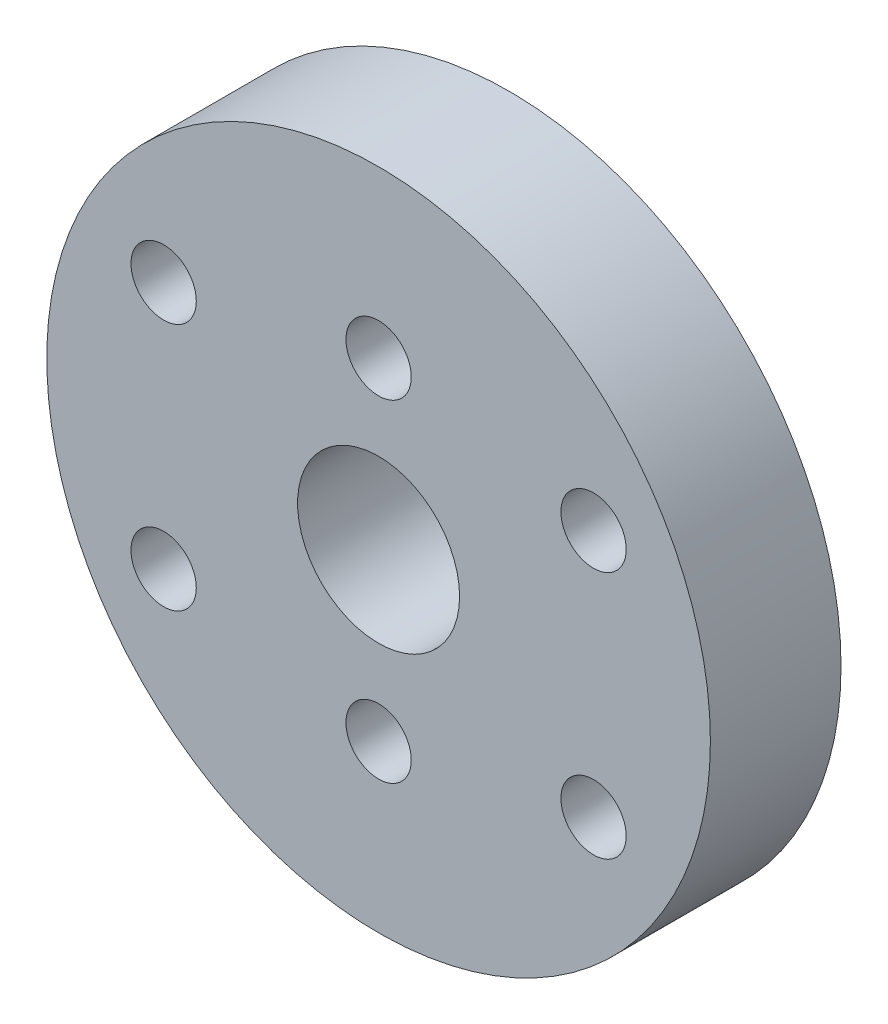
ISO-10303-21;
HEADER;
FILE_DESCRIPTION(('STEP AP214'),'2;1');
FILE_NAME('part.step','',(''),(''),'','','');
FILE_SCHEMA(('AUTOMOTIVE_DESIGN { 1 0 10303 214 1 1 1 1 }'));
ENDSEC;
DATA;
#1=APPLICATION_CONTEXT('core data for automotive mechanical design processes');
#2=APPLICATION_PROTOCOL_DEFINITION('international standard','automotive_design',2000,#1);
#3=PRODUCT_CONTEXT('',#1,'mechanical');
#4=PRODUCT('Part','Part','',(#3));
#5=PRODUCT_RELATED_PRODUCT_CATEGORY('part','',(#4));
#6=PRODUCT_DEFINITION_FORMATION('','',#4);
#7=PRODUCT_DEFINITION_CONTEXT('part definition',#1,'design');
#8=PRODUCT_DEFINITION('design','',#6,#7);
#9=PRODUCT_DEFINITION_SHAPE('','',#8);
#10=(LENGTH_UNIT() NAMED_UNIT(*) SI_UNIT(.MILLI.,.METRE.));
#11=(NAMED_UNIT(*) PLANE_ANGLE_UNIT() SI_UNIT($,.RADIAN.));
#12=(NAMED_UNIT(*) SI_UNIT($,.STERADIAN.) SOLID_ANGLE_UNIT());
#13=UNCERTAINTY_MEASURE_WITH_UNIT(LENGTH_MEASURE(1.E-05),#10,'distance_accuracy_value','');
#14=(GEOMETRIC_REPRESENTATION_CONTEXT(3) GLOBAL_UNCERTAINTY_ASSIGNED_CONTEXT((#13)) GLOBAL_UNIT_ASSIGNED_CONTEXT((#10,
#11,#12)) REPRESENTATION_CONTEXT('',''));
#15=CARTESIAN_POINT('',(0.,0.,0.));
#16=DIRECTION('',(0.,0.,1.));
#17=DIRECTION('',(1.,0.,0.));
#18=AXIS2_PLACEMENT_3D('',#15,#16,#17);
#19=CARTESIAN_POINT('',(0.,0.,5.));
#20=DIRECTION('',(0.,0.,1.));
#21=DIRECTION('',(1.,0.,0.));
#22=AXIS2_PLACEMENT_3D('',#19,#20,#21);
#23=PLANE('',#22);
#24=CARTESIAN_POINT('',(-8.22724133595136,-4.75000000000047,5.));
#25=DIRECTION('',(0.,0.,1.));
#26=DIRECTION('',(1.,0.,0.));
#27=AXIS2_PLACEMENT_3D('',#24,#25,#26);
#28=CIRCLE('',#27,1.250000000001);
#29=CARTESIAN_POINT('',(-6.97724133595036,-4.75000000000047,5.));
#30=VERTEX_POINT('',#29);
#31=EDGE_CURVE('E71',#30,#30,#28,.T.);
#32=ORIENTED_EDGE('',*,*,#31,.F.);
#33=EDGE_LOOP('',(#32));
#34=FACE_BOUND('',#33,.T.);
#35=CARTESIAN_POINT('',(8.22724133595298,-4.74999999999953,5.));
#36=DIRECTION('',(0.,0.,1.));
#37=DIRECTION('',(1.,0.,0.));
#38=AXIS2_PLACEMENT_3D('',#35,#36,#37);
#39=CIRCLE('',#38,1.25000000000068);
#40=CARTESIAN_POINT('',(9.47724133595366,-4.74999999999953,5.));
#41=VERTEX_POINT('',#40);
#42=EDGE_CURVE('E59',#41,#41,#39,.T.);
#43=ORIENTED_EDGE('',*,*,#42,.F.);
#44=EDGE_LOOP('',(#43));
#45=FACE_BOUND('',#44,.T.);
#46=CARTESIAN_POINT('',(0.,0.,5.));
#47=DIRECTION('',(0.,0.,1.));
#48=DIRECTION('',(1.,0.,0.));
#49=AXIS2_PLACEMENT_3D('',#46,#47,#48);
#50=CIRCLE('',#49,3.1);
#51=CARTESIAN_POINT('',(3.1,0.,5.));
#52=VERTEX_POINT('',#51);
#53=EDGE_CURVE('E47',#52,#52,#50,.T.);
#54=ORIENTED_EDGE('',*,*,#53,.F.);
#55=EDGE_LOOP('',(#54));
#56=FACE_BOUND('',#55,.T.);
#57=CARTESIAN_POINT('',(0.,0.,5.));
#58=DIRECTION('',(0.,0.,1.));
#59=DIRECTION('',(1.,0.,0.));
#60=AXIS2_PLACEMENT_3D('',#57,#58,#59);
#61=CIRCLE('',#60,12.7);
#62=CARTESIAN_POINT('',(12.7,0.,5.));
#63=VERTEX_POINT('',#62);
#64=EDGE_CURVE('E10',#63,#63,#61,.T.);
#65=ORIENTED_EDGE('',*,*,#64,.T.);
#66=EDGE_LOOP('',(#65));
#67=FACE_BOUND('',#66,.T.);
#68=CARTESIAN_POINT('',(0.,6.35,5.));
#69=DIRECTION('',(0.,0.,1.));
#70=DIRECTION('',(1.,0.,0.));
#71=AXIS2_PLACEMENT_3D('',#68,#69,#70);
#72=CIRCLE('',#71,1.25);
#73=CARTESIAN_POINT('',(1.25,6.35,5.));
#74=VERTEX_POINT('',#73);
#75=EDGE_CURVE('E42',#74,#74,#72,.T.);
#76=ORIENTED_EDGE('',*,*,#75,.F.);
#77=EDGE_LOOP('',(#76));
#78=FACE_BOUND('',#77,.T.);
#79=CARTESIAN_POINT('',(8.22724133595243,4.75000000000047,5.));
#80=DIRECTION('',(0.,0.,1.));
#81=DIRECTION('',(1.,0.,0.));
#82=AXIS2_PLACEMENT_3D('',#79,#80,#81);
#83=CIRCLE('',#82,1.25000000000014);
#84=CARTESIAN_POINT('',(9.47724133595258,4.75000000000047,5.));
#85=VERTEX_POINT('',#84);
#86=EDGE_CURVE('E53',#85,#85,#83,.T.);
#87=ORIENTED_EDGE('',*,*,#86,.F.);
#88=EDGE_LOOP('',(#87));
#89=FACE_BOUND('',#88,.T.);
#90=CARTESIAN_POINT('',(0.,-6.35,5.));
#91=DIRECTION('',(0.,0.,1.));
#92=DIRECTION('',(1.,0.,0.));
#93=AXIS2_PLACEMENT_3D('',#90,#91,#92);
#94=CIRCLE('',#93,1.25);
#95=CARTESIAN_POINT('',(1.24999999999996,-6.35,5.));
#96=VERTEX_POINT('',#95);
#97=EDGE_CURVE('E65',#96,#96,#94,.T.);
#98=ORIENTED_EDGE('',*,*,#97,.F.);
#99=EDGE_LOOP('',(#98));
#100=FACE_BOUND('',#99,.T.);
#101=CARTESIAN_POINT('',(-8.2272413359519,4.74999999999953,5.));
#102=DIRECTION('',(0.,0.,1.));
#103=DIRECTION('',(1.,0.,0.));
#104=AXIS2_PLACEMENT_3D('',#101,#102,#103);
#105=CIRCLE('',#104,1.25000000000051);
#106=CARTESIAN_POINT('',(-6.97724133595139,4.74999999999953,5.));
#107=VERTEX_POINT('',#106);
#108=EDGE_CURVE('E77',#107,#107,#105,.T.);
#109=ORIENTED_EDGE('',*,*,#108,.F.);
#110=EDGE_LOOP('',(#109));
#111=FACE_BOUND('',#110,.T.);
#112=ADVANCED_FACE('F31',(#34,#45,#56,#67,#78,#89,#100,#111),#23,.T.);
#113=CARTESIAN_POINT('',(0.,0.,0.));
#114=DIRECTION('',(0.,0.,1.));
#115=DIRECTION('',(1.,0.,0.));
#116=AXIS2_PLACEMENT_3D('',#113,#114,#115);
#117=PLANE('',#116);
#118=CARTESIAN_POINT('',(-8.22724133595136,-4.75000000000047,0.));
#119=DIRECTION('',(0.,0.,1.));
#120=DIRECTION('',(1.,0.,0.));
#121=AXIS2_PLACEMENT_3D('',#118,#119,#120);
#122=CIRCLE('',#121,1.250000000001);
#123=CARTESIAN_POINT('',(-6.97724133595036,-4.75000000000047,0.));
#124=VERTEX_POINT('',#123);
#125=EDGE_CURVE('E74',#124,#124,#122,.T.);
#126=ORIENTED_EDGE('',*,*,#125,.T.);
#127=EDGE_LOOP('',(#126));
#128=FACE_BOUND('',#127,.T.);
#129=CARTESIAN_POINT('',(8.22724133595298,-4.74999999999953,0.));
#130=DIRECTION('',(0.,0.,1.));
#131=DIRECTION('',(1.,0.,0.));
#132=AXIS2_PLACEMENT_3D('',#129,#130,#131);
#133=CIRCLE('',#132,1.25000000000068);
#134=CARTESIAN_POINT('',(9.47724133595366,-4.74999999999953,0.));
#135=VERTEX_POINT('',#134);
#136=EDGE_CURVE('E62',#135,#135,#133,.T.);
#137=ORIENTED_EDGE('',*,*,#136,.T.);
#138=EDGE_LOOP('',(#137));
#139=FACE_BOUND('',#138,.T.);
#140=CARTESIAN_POINT('',(0.,0.,0.));
#141=DIRECTION('',(0.,0.,1.));
#142=DIRECTION('',(1.,0.,0.));
#143=AXIS2_PLACEMENT_3D('',#140,#141,#142);
#144=CIRCLE('',#143,3.1);
#145=CARTESIAN_POINT('',(3.1,0.,0.));
#146=VERTEX_POINT('',#145);
#147=EDGE_CURVE('E50',#146,#146,#144,.T.);
#148=ORIENTED_EDGE('',*,*,#147,.T.);
#149=EDGE_LOOP('',(#148));
#150=FACE_BOUND('',#149,.T.);
#151=CARTESIAN_POINT('',(0.,0.,0.));
#152=DIRECTION('',(0.,0.,1.));
#153=DIRECTION('',(1.,0.,0.));
#154=AXIS2_PLACEMENT_3D('',#151,#152,#153);
#155=CIRCLE('',#154,12.7);
#156=CARTESIAN_POINT('',(12.7,0.,0.));
#157=VERTEX_POINT('',#156);
#158=EDGE_CURVE('E35',#157,#157,#155,.T.);
#159=ORIENTED_EDGE('',*,*,#158,.F.);
#160=EDGE_LOOP('',(#159));
#161=FACE_BOUND('',#160,.T.);
#162=CARTESIAN_POINT('',(0.,6.35,0.));
#163=DIRECTION('',(0.,0.,1.));
#164=DIRECTION('',(1.,0.,0.));
#165=AXIS2_PLACEMENT_3D('',#162,#163,#164);
#166=CIRCLE('',#165,1.25);
#167=CARTESIAN_POINT('',(1.25,6.35,0.));
#168=VERTEX_POINT('',#167);
#169=EDGE_CURVE('E44',#168,#168,#166,.T.);
#170=ORIENTED_EDGE('',*,*,#169,.T.);
#171=EDGE_LOOP('',(#170));
#172=FACE_BOUND('',#171,.T.);
#173=CARTESIAN_POINT('',(8.22724133595243,4.75000000000047,0.));
#174=DIRECTION('',(0.,0.,1.));
#175=DIRECTION('',(1.,0.,0.));
#176=AXIS2_PLACEMENT_3D('',#173,#174,#175);
#177=CIRCLE('',#176,1.25000000000014);
#178=CARTESIAN_POINT('',(9.47724133595258,4.75000000000047,0.));
#179=VERTEX_POINT('',#178);
#180=EDGE_CURVE('E56',#179,#179,#177,.T.);
#181=ORIENTED_EDGE('',*,*,#180,.T.);
#182=EDGE_LOOP('',(#181));
#183=FACE_BOUND('',#182,.T.);
#184=CARTESIAN_POINT('',(0.,-6.35,0.));
#185=DIRECTION('',(0.,0.,1.));
#186=DIRECTION('',(1.,0.,0.));
#187=AXIS2_PLACEMENT_3D('',#184,#185,#186);
#188=CIRCLE('',#187,1.25);
#189=CARTESIAN_POINT('',(1.24999999999996,-6.35,0.));
#190=VERTEX_POINT('',#189);
#191=EDGE_CURVE('E68',#190,#190,#188,.T.);
#192=ORIENTED_EDGE('',*,*,#191,.T.);
#193=EDGE_LOOP('',(#192));
#194=FACE_BOUND('',#193,.T.);
#195=CARTESIAN_POINT('',(-8.2272413359519,4.74999999999953,0.));
#196=DIRECTION('',(0.,0.,1.));
#197=DIRECTION('',(1.,0.,0.));
#198=AXIS2_PLACEMENT_3D('',#195,#196,#197);
#199=CIRCLE('',#198,1.25000000000051);
#200=CARTESIAN_POINT('',(-6.97724133595139,4.74999999999953,0.));
#201=VERTEX_POINT('',#200);
#202=EDGE_CURVE('E80',#201,#201,#199,.T.);
#203=ORIENTED_EDGE('',*,*,#202,.T.);
#204=EDGE_LOOP('',(#203));
#205=FACE_BOUND('',#204,.T.);
#206=ADVANCED_FACE('F90',(#128,#139,#150,#161,#172,#183,#194,#205),#117,.F.);
#207=CARTESIAN_POINT('',(0.,0.,5.));
#208=DIRECTION('',(0.,0.,-1.));
#209=DIRECTION('',(-1.,0.,0.));
#210=AXIS2_PLACEMENT_3D('',#207,#208,#209);
#211=CYLINDRICAL_SURFACE('',#210,12.7);
#212=ORIENTED_EDGE('',*,*,#64,.F.);
#213=EDGE_LOOP('',(#212));
#214=FACE_BOUND('',#213,.T.);
#215=ORIENTED_EDGE('',*,*,#158,.T.);
#216=EDGE_LOOP('',(#215));
#217=FACE_BOUND('',#216,.T.);
#218=ADVANCED_FACE('F33',(#214,#217),#211,.T.);
#219=CARTESIAN_POINT('',(0.,6.35,5.));
#220=DIRECTION('',(0.,0.,-1.));
#221=DIRECTION('',(-1.,0.,0.));
#222=AXIS2_PLACEMENT_3D('',#219,#220,#221);
#223=CYLINDRICAL_SURFACE('',#222,1.25);
#224=ORIENTED_EDGE('',*,*,#75,.T.);
#225=EDGE_LOOP('',(#224));
#226=FACE_BOUND('',#225,.T.);
#227=ORIENTED_EDGE('',*,*,#169,.F.);
#228=EDGE_LOOP('',(#227));
#229=FACE_BOUND('',#228,.T.);
#230=ADVANCED_FACE('F100',(#226,#229),#223,.F.);
#231=CARTESIAN_POINT('',(0.,0.,5.));
#232=DIRECTION('',(0.,0.,-1.));
#233=DIRECTION('',(-1.,0.,0.));
#234=AXIS2_PLACEMENT_3D('',#231,#232,#233);
#235=CYLINDRICAL_SURFACE('',#234,3.1);
#236=ORIENTED_EDGE('',*,*,#53,.T.);
#237=EDGE_LOOP('',(#236));
#238=FACE_BOUND('',#237,.T.);
#239=ORIENTED_EDGE('',*,*,#147,.F.);
#240=EDGE_LOOP('',(#239));
#241=FACE_BOUND('',#240,.T.);
#242=ADVANCED_FACE('F103',(#238,#241),#235,.F.);
#243=CARTESIAN_POINT('',(8.22724133595243,4.75000000000047,5.));
#244=DIRECTION('',(0.,0.,-1.));
#245=DIRECTION('',(-1.,0.,0.));
#246=AXIS2_PLACEMENT_3D('',#243,#244,#245);
#247=CYLINDRICAL_SURFACE('',#246,1.25000000000014);
#248=ORIENTED_EDGE('',*,*,#86,.T.);
#249=EDGE_LOOP('',(#248));
#250=FACE_BOUND('',#249,.T.);
#251=ORIENTED_EDGE('',*,*,#180,.F.);
#252=EDGE_LOOP('',(#251));
#253=FACE_BOUND('',#252,.T.);
#254=ADVANCED_FACE('F107',(#250,#253),#247,.F.);
#255=CARTESIAN_POINT('',(8.22724133595298,-4.74999999999953,5.));
#256=DIRECTION('',(0.,0.,-1.));
#257=DIRECTION('',(-1.,0.,0.));
#258=AXIS2_PLACEMENT_3D('',#255,#256,#257);
#259=CYLINDRICAL_SURFACE('',#258,1.25000000000068);
#260=ORIENTED_EDGE('',*,*,#42,.T.);
#261=EDGE_LOOP('',(#260));
#262=FACE_BOUND('',#261,.T.);
#263=ORIENTED_EDGE('',*,*,#136,.F.);
#264=EDGE_LOOP('',(#263));
#265=FACE_BOUND('',#264,.T.);
#266=ADVANCED_FACE('F111',(#262,#265),#259,.F.);
#267=CARTESIAN_POINT('',(0.,-6.35,5.));
#268=DIRECTION('',(0.,0.,-1.));
#269=DIRECTION('',(-1.,0.,0.));
#270=AXIS2_PLACEMENT_3D('',#267,#268,#269);
#271=CYLINDRICAL_SURFACE('',#270,1.25);
#272=ORIENTED_EDGE('',*,*,#97,.T.);
#273=EDGE_LOOP('',(#272));
#274=FACE_BOUND('',#273,.T.);
#275=ORIENTED_EDGE('',*,*,#191,.F.);
#276=EDGE_LOOP('',(#275));
#277=FACE_BOUND('',#276,.T.);
#278=ADVANCED_FACE('F115',(#274,#277),#271,.F.);
#279=CARTESIAN_POINT('',(-8.22724133595136,-4.75000000000047,5.));
#280=DIRECTION('',(0.,0.,-1.));
#281=DIRECTION('',(-1.,0.,0.));
#282=AXIS2_PLACEMENT_3D('',#279,#280,#281);
#283=CYLINDRICAL_SURFACE('',#282,1.250000000001);
#284=ORIENTED_EDGE('',*,*,#31,.T.);
#285=EDGE_LOOP('',(#284));
#286=FACE_BOUND('',#285,.T.);
#287=ORIENTED_EDGE('',*,*,#125,.F.);
#288=EDGE_LOOP('',(#287));
#289=FACE_BOUND('',#288,.T.);
#290=ADVANCED_FACE('F119',(#286,#289),#283,.F.);
#291=CARTESIAN_POINT('',(-8.2272413359519,4.74999999999953,5.));
#292=DIRECTION('',(0.,0.,-1.));
#293=DIRECTION('',(-1.,0.,0.));
#294=AXIS2_PLACEMENT_3D('',#291,#292,#293);
#295=CYLINDRICAL_SURFACE('',#294,1.25000000000051);
#296=ORIENTED_EDGE('',*,*,#108,.T.);
#297=EDGE_LOOP('',(#296));
#298=FACE_BOUND('',#297,.T.);
#299=ORIENTED_EDGE('',*,*,#202,.F.);
#300=EDGE_LOOP('',(#299));
#301=FACE_BOUND('',#300,.T.);
#302=ADVANCED_FACE('F86',(#298,#301),#295,.F.);
#303=CLOSED_SHELL('',(#112,#206,#218,#230,#242,#254,#266,#278,#290,#302));
#304=MANIFOLD_SOLID_BREP('B2',#303);
#305=ADVANCED_BREP_SHAPE_REPRESENTATION('',(#18,#304),#14);
#306=SHAPE_DEFINITION_REPRESENTATION(#9,#305);
ENDSEC;
END-ISO-10303-21;
